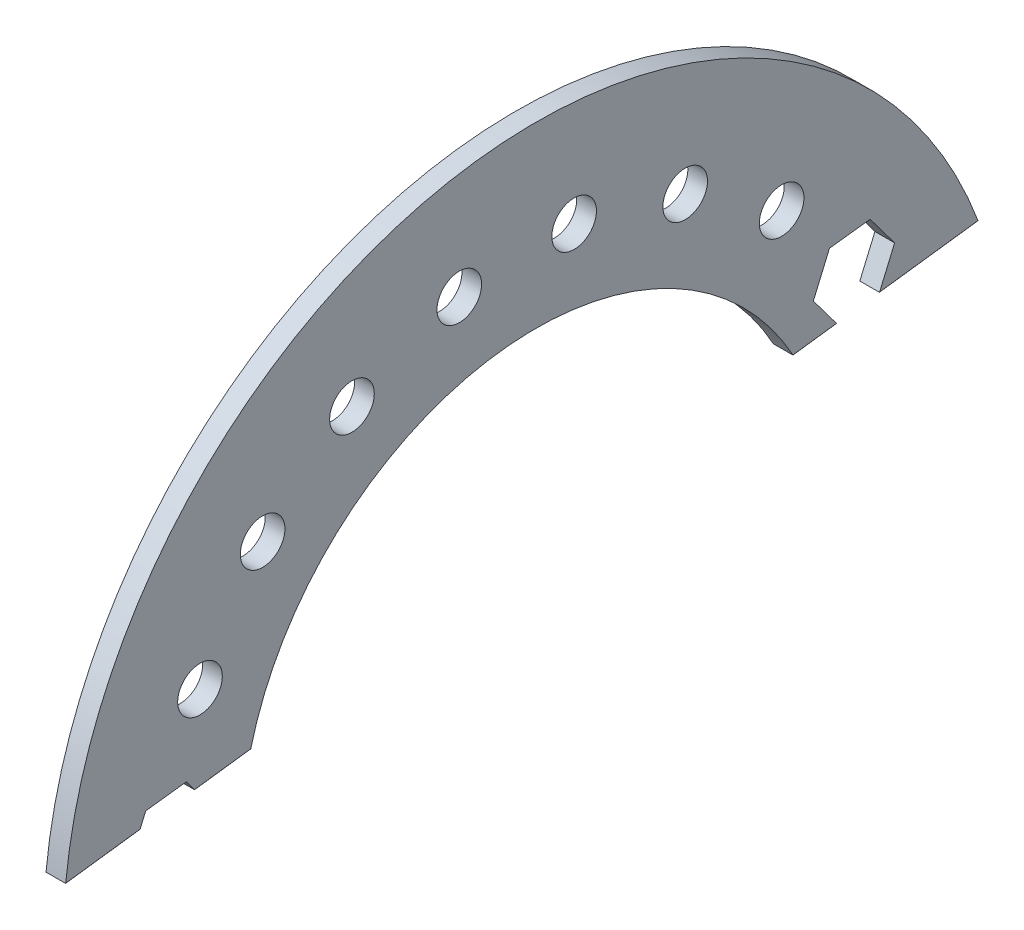
ISO-10303-21;
HEADER;
FILE_DESCRIPTION(('STEP AP214'),'2;1');
FILE_NAME('part.step','',(''),(''),'','','');
FILE_SCHEMA(('AUTOMOTIVE_DESIGN { 1 0 10303 214 1 1 1 1 }'));
ENDSEC;
DATA;
#1=APPLICATION_CONTEXT('core data for automotive mechanical design processes');
#2=APPLICATION_PROTOCOL_DEFINITION('international standard','automotive_design',2000,#1);
#3=PRODUCT_CONTEXT('',#1,'mechanical');
#4=PRODUCT('Part','Part','',(#3));
#5=PRODUCT_RELATED_PRODUCT_CATEGORY('part','',(#4));
#6=PRODUCT_DEFINITION_FORMATION('','',#4);
#7=PRODUCT_DEFINITION_CONTEXT('part definition',#1,'design');
#8=PRODUCT_DEFINITION('design','',#6,#7);
#9=PRODUCT_DEFINITION_SHAPE('','',#8);
#10=(LENGTH_UNIT() NAMED_UNIT(*) SI_UNIT(.MILLI.,.METRE.));
#11=(NAMED_UNIT(*) PLANE_ANGLE_UNIT() SI_UNIT($,.RADIAN.));
#12=(NAMED_UNIT(*) SI_UNIT($,.STERADIAN.) SOLID_ANGLE_UNIT());
#13=UNCERTAINTY_MEASURE_WITH_UNIT(LENGTH_MEASURE(1.E-05),#10,'distance_accuracy_value','');
#14=(GEOMETRIC_REPRESENTATION_CONTEXT(3) GLOBAL_UNCERTAINTY_ASSIGNED_CONTEXT((#13)) GLOBAL_UNIT_ASSIGNED_CONTEXT((#10,
#11,#12)) REPRESENTATION_CONTEXT('',''));
#15=CARTESIAN_POINT('',(0.,0.,0.));
#16=DIRECTION('',(0.,0.,1.));
#17=DIRECTION('',(1.,0.,0.));
#18=AXIS2_PLACEMENT_3D('',#15,#16,#17);
#19=CARTESIAN_POINT('',(4.,157.202027839605,-273.001781190754));
#20=DIRECTION('',(-1.,0.,0.));
#21=DIRECTION('',(0.,0.,1.));
#22=AXIS2_PLACEMENT_3D('',#19,#20,#21);
#23=CYLINDRICAL_SURFACE('',#22,4.24999999999995);
#24=CARTESIAN_POINT('',(0.,157.202027839605,-273.001781190754));
#25=DIRECTION('',(-1.,0.,0.));
#26=DIRECTION('',(0.,0.,1.));
#27=AXIS2_PLACEMENT_3D('',#24,#25,#26);
#28=CIRCLE('',#27,4.24999999999995);
#29=CARTESIAN_POINT('',(0.,157.202027839605,-268.751781190754));
#30=VERTEX_POINT('',#29);
#31=EDGE_CURVE('E301',#30,#30,#28,.T.);
#32=ORIENTED_EDGE('',*,*,#31,.T.);
#33=EDGE_LOOP('',(#32));
#34=FACE_BOUND('',#33,.T.);
#35=CARTESIAN_POINT('',(3.75,157.202027839605,-273.001781190754));
#36=DIRECTION('',(1.,0.,0.));
#37=DIRECTION('',(0.,0.,-1.));
#38=AXIS2_PLACEMENT_3D('',#35,#36,#37);
#39=CIRCLE('',#38,4.24999999999995);
#40=CARTESIAN_POINT('',(3.75,157.202027839605,-277.251781190754));
#41=VERTEX_POINT('',#40);
#42=EDGE_CURVE('E11',#41,#41,#39,.F.);
#43=ORIENTED_EDGE('',*,*,#42,.F.);
#44=EDGE_LOOP('',(#43));
#45=FACE_BOUND('',#44,.T.);
#46=ADVANCED_FACE('F35',(#34,#45),#23,.F.);
#47=CARTESIAN_POINT('',(4.,169.130072091169,-254.63420376094));
#48=DIRECTION('',(-1.,0.,0.));
#49=DIRECTION('',(0.,0.,1.));
#50=AXIS2_PLACEMENT_3D('',#47,#48,#49);
#51=CYLINDRICAL_SURFACE('',#50,4.24999999999995);
#52=CARTESIAN_POINT('',(0.,169.130072091169,-254.63420376094));
#53=DIRECTION('',(-1.,0.,0.));
#54=DIRECTION('',(0.,0.,1.));
#55=AXIS2_PLACEMENT_3D('',#52,#53,#54);
#56=CIRCLE('',#55,4.24999999999995);
#57=CARTESIAN_POINT('',(0.,169.130072091169,-250.38420376094));
#58=VERTEX_POINT('',#57);
#59=EDGE_CURVE('E304',#58,#58,#56,.T.);
#60=ORIENTED_EDGE('',*,*,#59,.T.);
#61=EDGE_LOOP('',(#60));
#62=FACE_BOUND('',#61,.T.);
#63=CARTESIAN_POINT('',(3.75,169.130072091169,-254.63420376094));
#64=DIRECTION('',(1.,0.,0.));
#65=DIRECTION('',(0.,0.,-1.));
#66=AXIS2_PLACEMENT_3D('',#63,#64,#65);
#67=CIRCLE('',#66,4.24999999999995);
#68=CARTESIAN_POINT('',(3.75,169.130072091169,-258.88420376094));
#69=VERTEX_POINT('',#68);
#70=EDGE_CURVE('E46',#69,#69,#67,.F.);
#71=ORIENTED_EDGE('',*,*,#70,.F.);
#72=EDGE_LOOP('',(#71));
#73=FACE_BOUND('',#72,.T.);
#74=ADVANCED_FACE('F423',(#62,#73),#51,.F.);
#75=CARTESIAN_POINT('',(4.,174.798422731966,-233.47963117437));
#76=DIRECTION('',(-1.,0.,0.));
#77=DIRECTION('',(0.,0.,1.));
#78=AXIS2_PLACEMENT_3D('',#75,#76,#77);
#79=CYLINDRICAL_SURFACE('',#78,4.25000000000001);
#80=CARTESIAN_POINT('',(0.,174.798422731966,-233.47963117437));
#81=DIRECTION('',(-1.,0.,0.));
#82=DIRECTION('',(0.,0.,1.));
#83=AXIS2_PLACEMENT_3D('',#80,#81,#82);
#84=CIRCLE('',#83,4.25000000000001);
#85=CARTESIAN_POINT('',(0.,174.798422731966,-229.22963117437));
#86=VERTEX_POINT('',#85);
#87=EDGE_CURVE('E307',#86,#86,#84,.T.);
#88=ORIENTED_EDGE('',*,*,#87,.T.);
#89=EDGE_LOOP('',(#88));
#90=FACE_BOUND('',#89,.T.);
#91=CARTESIAN_POINT('',(3.75,174.798422731966,-233.47963117437));
#92=DIRECTION('',(1.,0.,0.));
#93=DIRECTION('',(0.,0.,-1.));
#94=AXIS2_PLACEMENT_3D('',#91,#92,#93);
#95=CIRCLE('',#94,4.25000000000001);
#96=CARTESIAN_POINT('',(3.75,174.798422731966,-237.72963117437));
#97=VERTEX_POINT('',#96);
#98=EDGE_CURVE('E498',#97,#97,#95,.F.);
#99=ORIENTED_EDGE('',*,*,#98,.F.);
#100=EDGE_LOOP('',(#99));
#101=FACE_BOUND('',#100,.T.);
#102=ADVANCED_FACE('F429',(#90,#101),#79,.F.);
#103=CARTESIAN_POINT('',(4.,173.652222107554,-211.608820388391));
#104=DIRECTION('',(-1.,0.,0.));
#105=DIRECTION('',(0.,0.,1.));
#106=AXIS2_PLACEMENT_3D('',#103,#104,#105);
#107=CYLINDRICAL_SURFACE('',#106,4.25000000000001);
#108=CARTESIAN_POINT('',(0.,173.652222107554,-211.608820388391));
#109=DIRECTION('',(-1.,0.,0.));
#110=DIRECTION('',(0.,0.,1.));
#111=AXIS2_PLACEMENT_3D('',#108,#109,#110);
#112=CIRCLE('',#111,4.25000000000001);
#113=CARTESIAN_POINT('',(0.,173.652222107554,-207.358820388391));
#114=VERTEX_POINT('',#113);
#115=EDGE_CURVE('E310',#114,#114,#112,.T.);
#116=ORIENTED_EDGE('',*,*,#115,.T.);
#117=EDGE_LOOP('',(#116));
#118=FACE_BOUND('',#117,.T.);
#119=CARTESIAN_POINT('',(3.75,173.652222107554,-211.608820388391));
#120=DIRECTION('',(1.,0.,0.));
#121=DIRECTION('',(0.,0.,-1.));
#122=AXIS2_PLACEMENT_3D('',#119,#120,#121);
#123=CIRCLE('',#122,4.25000000000001);
#124=CARTESIAN_POINT('',(3.75,173.652222107554,-215.858820388391));
#125=VERTEX_POINT('',#124);
#126=EDGE_CURVE('E501',#125,#125,#123,.F.);
#127=ORIENTED_EDGE('',*,*,#126,.F.);
#128=EDGE_LOOP('',(#127));
#129=FACE_BOUND('',#128,.T.);
#130=ADVANCED_FACE('F437',(#118,#129),#107,.F.);
#131=CARTESIAN_POINT('',(4.,165.803668321098,-191.162638745634));
#132=DIRECTION('',(-1.,0.,0.));
#133=DIRECTION('',(0.,0.,1.));
#134=AXIS2_PLACEMENT_3D('',#131,#132,#133);
#135=CYLINDRICAL_SURFACE('',#134,4.25000000000001);
#136=CARTESIAN_POINT('',(0.,165.803668321098,-191.162638745634));
#137=DIRECTION('',(-1.,0.,0.));
#138=DIRECTION('',(0.,0.,1.));
#139=AXIS2_PLACEMENT_3D('',#136,#137,#138);
#140=CIRCLE('',#139,4.25000000000001);
#141=CARTESIAN_POINT('',(0.,165.803668321098,-186.912638745634));
#142=VERTEX_POINT('',#141);
#143=EDGE_CURVE('E313',#142,#142,#140,.T.);
#144=ORIENTED_EDGE('',*,*,#143,.T.);
#145=EDGE_LOOP('',(#144));
#146=FACE_BOUND('',#145,.T.);
#147=CARTESIAN_POINT('',(3.75,165.803668321098,-191.162638745634));
#148=DIRECTION('',(1.,0.,0.));
#149=DIRECTION('',(0.,0.,-1.));
#150=AXIS2_PLACEMENT_3D('',#147,#148,#149);
#151=CIRCLE('',#150,4.25000000000001);
#152=CARTESIAN_POINT('',(3.75,165.803668321098,-195.412638745634));
#153=VERTEX_POINT('',#152);
#154=EDGE_CURVE('E506',#153,#153,#151,.F.);
#155=ORIENTED_EDGE('',*,*,#154,.F.);
#156=EDGE_LOOP('',(#155));
#157=FACE_BOUND('',#156,.T.);
#158=ADVANCED_FACE('F441',(#146,#157),#135,.F.);
#159=CARTESIAN_POINT('',(4.,152.021032501307,-174.142500962217));
#160=DIRECTION('',(-1.,0.,0.));
#161=DIRECTION('',(0.,0.,1.));
#162=AXIS2_PLACEMENT_3D('',#159,#160,#161);
#163=CYLINDRICAL_SURFACE('',#162,4.25000000000001);
#164=CARTESIAN_POINT('',(0.,152.021032501307,-174.142500962217));
#165=DIRECTION('',(-1.,0.,0.));
#166=DIRECTION('',(0.,0.,1.));
#167=AXIS2_PLACEMENT_3D('',#164,#165,#166);
#168=CIRCLE('',#167,4.25000000000001);
#169=CARTESIAN_POINT('',(0.,152.021032501307,-169.892500962217));
#170=VERTEX_POINT('',#169);
#171=EDGE_CURVE('E316',#170,#170,#168,.T.);
#172=ORIENTED_EDGE('',*,*,#171,.T.);
#173=EDGE_LOOP('',(#172));
#174=FACE_BOUND('',#173,.T.);
#175=CARTESIAN_POINT('',(3.75,152.021032501307,-174.142500962217));
#176=DIRECTION('',(1.,0.,0.));
#177=DIRECTION('',(0.,0.,-1.));
#178=AXIS2_PLACEMENT_3D('',#175,#176,#177);
#179=CIRCLE('',#178,4.25000000000001);
#180=CARTESIAN_POINT('',(3.75,152.021032501307,-178.392500962217));
#181=VERTEX_POINT('',#180);
#182=EDGE_CURVE('E508',#181,#181,#179,.F.);
#183=ORIENTED_EDGE('',*,*,#182,.F.);
#184=EDGE_LOOP('',(#183));
#185=FACE_BOUND('',#184,.T.);
#186=ADVANCED_FACE('F445',(#174,#185),#163,.F.);
#187=CARTESIAN_POINT('',(4.,133.653455071493,-162.214456710652));
#188=DIRECTION('',(-1.,0.,0.));
#189=DIRECTION('',(0.,0.,1.));
#190=AXIS2_PLACEMENT_3D('',#187,#188,#189);
#191=CYLINDRICAL_SURFACE('',#190,4.25000000000001);
#192=CARTESIAN_POINT('',(0.,133.653455071493,-162.214456710652));
#193=DIRECTION('',(-1.,0.,0.));
#194=DIRECTION('',(0.,0.,1.));
#195=AXIS2_PLACEMENT_3D('',#192,#193,#194);
#196=CIRCLE('',#195,4.25000000000001);
#197=CARTESIAN_POINT('',(0.,133.653455071493,-157.964456710652));
#198=VERTEX_POINT('',#197);
#199=EDGE_CURVE('E319',#198,#198,#196,.T.);
#200=ORIENTED_EDGE('',*,*,#199,.T.);
#201=EDGE_LOOP('',(#200));
#202=FACE_BOUND('',#201,.T.);
#203=CARTESIAN_POINT('',(3.75,133.653455071493,-162.214456710652));
#204=DIRECTION('',(1.,0.,0.));
#205=DIRECTION('',(0.,0.,-1.));
#206=AXIS2_PLACEMENT_3D('',#203,#204,#205);
#207=CIRCLE('',#206,4.25000000000001);
#208=CARTESIAN_POINT('',(3.75,133.653455071493,-166.464456710652));
#209=VERTEX_POINT('',#208);
#210=EDGE_CURVE('E355',#209,#209,#207,.F.);
#211=ORIENTED_EDGE('',*,*,#210,.F.);
#212=EDGE_LOOP('',(#211));
#213=FACE_BOUND('',#212,.T.);
#214=ADVANCED_FACE('F449',(#202,#213),#191,.F.);
#215=CARTESIAN_POINT('',(145.321367132431,146.422235875612,-282.11450437174));
#216=DIRECTION('',(0.,0.992946793169425,0.118560811124734));
#217=DIRECTION('',(0.,-0.118560811124734,0.992946793169425));
#218=AXIS2_PLACEMENT_3D('',#215,#216,#217);
#219=PLANE('',#218);
#220=DIRECTION('',(0.,0.118560811124734,-0.992946793169425));
#221=VECTOR('',#220,1.);
#222=CARTESIAN_POINT('',(3.75,146.422235875612,-282.11450437174));
#223=LINE('',#222,#221);
#224=CARTESIAN_POINT('',(3.75,146.422235875612,-282.11450437174));
#225=VERTEX_POINT('',#224);
#226=CARTESIAN_POINT('',(3.75,147.346325944559,-289.853758699165));
#227=VERTEX_POINT('',#226);
#228=EDGE_CURVE('E369',#225,#227,#223,.T.);
#229=ORIENTED_EDGE('',*,*,#228,.F.);
#230=DIRECTION('',(-1.,0.,0.));
#231=VECTOR('',#230,1.);
#232=CARTESIAN_POINT('',(145.321367132431,146.422235875612,-282.11450437174));
#233=LINE('',#232,#231);
#234=CARTESIAN_POINT('',(0.,146.422235875612,-282.11450437174));
#235=VERTEX_POINT('',#234);
#236=EDGE_CURVE('E322',#225,#235,#233,.T.);
#237=ORIENTED_EDGE('',*,*,#236,.T.);
#238=DIRECTION('',(0.,0.118560811124734,-0.992946793169425));
#239=VECTOR('',#238,1.);
#240=CARTESIAN_POINT('',(0.,146.422235875612,-282.11450437174));
#241=LINE('',#240,#239);
#242=CARTESIAN_POINT('',(0.,147.346325944559,-289.853758699165));
#243=VERTEX_POINT('',#242);
#244=EDGE_CURVE('E334',#235,#243,#241,.T.);
#245=ORIENTED_EDGE('',*,*,#244,.T.);
#246=DIRECTION('',(-1.,0.,0.));
#247=VECTOR('',#246,1.);
#248=CARTESIAN_POINT('',(145.321367132431,147.346325944559,-289.853758699165));
#249=LINE('',#248,#247);
#250=EDGE_CURVE('E40',#227,#243,#249,.T.);
#251=ORIENTED_EDGE('',*,*,#250,.F.);
#252=EDGE_LOOP('',(#229,#237,#245,#251));
#253=FACE_BOUND('',#252,.T.);
#254=ADVANCED_FACE('F408',(#253),#219,.F.);
#255=CARTESIAN_POINT('',(145.321367132431,139.257799987241,-279.045162683121));
#256=DIRECTION('',(0.,0.393796722257408,0.919197553053381));
#257=DIRECTION('',(0.,-0.919197553053381,0.393796722257408));
#258=AXIS2_PLACEMENT_3D('',#255,#256,#257);
#259=PLANE('',#258);
#260=DIRECTION('',(0.,0.919197553053381,-0.393796722257408));
#261=VECTOR('',#260,1.);
#262=CARTESIAN_POINT('',(3.75,139.257799987241,-279.045162683121));
#263=LINE('',#262,#261);
#264=CARTESIAN_POINT('',(3.75,139.257799987241,-279.045162683121));
#265=VERTEX_POINT('',#264);
#266=EDGE_CURVE('E376',#265,#225,#263,.T.);
#267=ORIENTED_EDGE('',*,*,#266,.F.);
#268=DIRECTION('',(-1.,0.,0.));
#269=VECTOR('',#268,1.);
#270=CARTESIAN_POINT('',(145.321367132431,139.257799987241,-279.045162683121));
#271=LINE('',#270,#269);
#272=CARTESIAN_POINT('',(0.,139.257799987241,-279.045162683121));
#273=VERTEX_POINT('',#272);
#274=EDGE_CURVE('E331',#265,#273,#271,.T.);
#275=ORIENTED_EDGE('',*,*,#274,.T.);
#276=DIRECTION('',(0.,0.91919755305338,-0.393796722257408));
#277=VECTOR('',#276,1.);
#278=CARTESIAN_POINT('',(0.,139.257799987241,-279.045162683121));
#279=LINE('',#278,#277);
#280=EDGE_CURVE('E333',#273,#235,#279,.T.);
#281=ORIENTED_EDGE('',*,*,#280,.T.);
#282=ORIENTED_EDGE('',*,*,#236,.F.);
#283=EDGE_LOOP('',(#267,#275,#281,#282));
#284=FACE_BOUND('',#283,.T.);
#285=ADVANCED_FACE('F401',(#284),#259,.F.);
#286=CARTESIAN_POINT('',(145.321367132431,147.346325944559,-289.853758699165));
#287=DIRECTION('',(0.,0.59915007091202,-0.800636741928649));
#288=DIRECTION('',(0.,0.800636741928649,0.59915007091202));
#289=AXIS2_PLACEMENT_3D('',#286,#287,#288);
#290=PLANE('',#289);
#291=DIRECTION('',(0.,-0.800636741928649,-0.59915007091202));
#292=VECTOR('',#291,1.);
#293=CARTESIAN_POINT('',(3.75,147.346325944559,-289.853758699165));
#294=LINE('',#293,#292);
#295=CARTESIAN_POINT('',(3.75,141.105980125134,-294.523671337969));
#296=VERTEX_POINT('',#295);
#297=EDGE_CURVE('E367',#227,#296,#294,.T.);
#298=ORIENTED_EDGE('',*,*,#297,.F.);
#299=ORIENTED_EDGE('',*,*,#250,.T.);
#300=DIRECTION('',(0.,-0.800636741928649,-0.59915007091202));
#301=VECTOR('',#300,1.);
#302=CARTESIAN_POINT('',(0.,147.346325944559,-289.853758699165));
#303=LINE('',#302,#301);
#304=CARTESIAN_POINT('',(0.,141.105980125134,-294.523671337969));
#305=VERTEX_POINT('',#304);
#306=EDGE_CURVE('E192',#243,#305,#303,.T.);
#307=ORIENTED_EDGE('',*,*,#306,.T.);
#308=DIRECTION('',(-1.,0.,0.));
#309=VECTOR('',#308,1.);
#310=CARTESIAN_POINT('',(145.321367132431,141.105980125134,-294.523671337969));
#311=LINE('',#310,#309);
#312=EDGE_CURVE('E196',#296,#305,#311,.T.);
#313=ORIENTED_EDGE('',*,*,#312,.F.);
#314=EDGE_LOOP('',(#298,#299,#307,#313));
#315=FACE_BOUND('',#314,.T.);
#316=ADVANCED_FACE('F410',(#315),#290,.F.);
#317=CARTESIAN_POINT('',(145.321367132431,118.739228304347,-151.876193431051));
#318=DIRECTION('',(0.,0.992946793169425,0.118560811124735));
#319=DIRECTION('',(0.,-0.118560811124735,0.992946793169425));
#320=AXIS2_PLACEMENT_3D('',#317,#318,#319);
#321=PLANE('',#320);
#322=DIRECTION('',(0.,0.118560811124735,-0.992946793169425));
#323=VECTOR('',#322,1.);
#324=CARTESIAN_POINT('',(3.75,118.739228304347,-151.876193431051));
#325=LINE('',#324,#323);
#326=CARTESIAN_POINT('',(3.75,118.739228304347,-151.876193431051));
#327=VERTEX_POINT('',#326);
#328=CARTESIAN_POINT('',(3.75,119.663318373294,-159.615447758475));
#329=VERTEX_POINT('',#328);
#330=EDGE_CURVE('E365',#327,#329,#325,.T.);
#331=ORIENTED_EDGE('',*,*,#330,.F.);
#332=DIRECTION('',(-1.,0.,0.));
#333=VECTOR('',#332,1.);
#334=CARTESIAN_POINT('',(145.321367132431,118.739228304347,-151.876193431051));
#335=LINE('',#334,#333);
#336=CARTESIAN_POINT('',(0.,118.739228304347,-151.876193431051));
#337=VERTEX_POINT('',#336);
#338=EDGE_CURVE('E197',#327,#337,#335,.T.);
#339=ORIENTED_EDGE('',*,*,#338,.T.);
#340=DIRECTION('',(0.,0.118560811124735,-0.992946793169425));
#341=VECTOR('',#340,1.);
#342=CARTESIAN_POINT('',(0.,118.739228304347,-151.876193431051));
#343=LINE('',#342,#341);
#344=CARTESIAN_POINT('',(0.,119.663318373294,-159.615447758475));
#345=VERTEX_POINT('',#344);
#346=EDGE_CURVE('E199',#337,#345,#343,.T.);
#347=ORIENTED_EDGE('',*,*,#346,.T.);
#348=DIRECTION('',(-1.,0.,0.));
#349=VECTOR('',#348,1.);
#350=CARTESIAN_POINT('',(145.321367132431,119.663318373294,-159.615447758475));
#351=LINE('',#350,#349);
#352=EDGE_CURVE('E188',#329,#345,#351,.T.);
#353=ORIENTED_EDGE('',*,*,#352,.F.);
#354=EDGE_LOOP('',(#331,#339,#347,#353));
#355=FACE_BOUND('',#354,.T.);
#356=ADVANCED_FACE('F412',(#355),#321,.F.);
#357=CARTESIAN_POINT('',(145.321367132431,133.017454167817,-283.715075321925));
#358=DIRECTION('',(0.,-0.59915007091202,0.800636741928649));
#359=DIRECTION('',(0.,-0.800636741928649,-0.59915007091202));
#360=AXIS2_PLACEMENT_3D('',#357,#358,#359);
#361=PLANE('',#360);
#362=DIRECTION('',(0.,0.800636741928649,0.59915007091202));
#363=VECTOR('',#362,1.);
#364=CARTESIAN_POINT('',(3.75,133.017454167817,-283.715075321925));
#365=LINE('',#364,#363);
#366=CARTESIAN_POINT('',(3.75000000000009,133.36816133066,-283.452626435329));
#367=VERTEX_POINT('',#366);
#368=EDGE_CURVE('E378',#367,#265,#365,.T.);
#369=ORIENTED_EDGE('',*,*,#368,.F.);
#370=CARTESIAN_POINT('',(34.,119.075359540964,-294.148529779959));
#371=DIRECTION('',(0.,-0.59915007091202,0.800636741928649));
#372=DIRECTION('',(0.,-0.800636741928649,-0.59915007091202));
#373=AXIS2_PLACEMENT_3D('',#370,#371,#372);
#374=ELLIPSE('',#373,39.0592773065958,34.01);
#375=CARTESIAN_POINT('',(3.72740348103585,133.327653987745,-283.482939779833));
#376=VERTEX_POINT('',#375);
#377=EDGE_CURVE('E203',#367,#376,#374,.T.);
#378=ORIENTED_EDGE('',*,*,#377,.T.);
#379=DIRECTION('',(-1.,0.,0.));
#380=VECTOR('',#379,1.);
#381=CARTESIAN_POINT('',(4.,133.327653987745,-283.482939779833));
#382=LINE('',#381,#380);
#383=CARTESIAN_POINT('',(0.,133.327653987745,-283.482939779833));
#384=VERTEX_POINT('',#383);
#385=EDGE_CURVE('E323',#376,#384,#382,.T.);
#386=ORIENTED_EDGE('',*,*,#385,.T.);
#387=DIRECTION('',(0.,0.800636741928649,0.59915007091202));
#388=VECTOR('',#387,1.);
#389=CARTESIAN_POINT('',(0.,133.017454167817,-283.715075321925));
#390=LINE('',#389,#388);
#391=EDGE_CURVE('E325',#384,#273,#390,.T.);
#392=ORIENTED_EDGE('',*,*,#391,.T.);
#393=ORIENTED_EDGE('',*,*,#274,.F.);
#394=EDGE_LOOP('',(#369,#378,#386,#392,#393));
#395=FACE_BOUND('',#394,.T.);
#396=ADVANCED_FACE('F217',(#395),#361,.F.);
#397=CARTESIAN_POINT('',(4.,105.17999306,-226.16160191));
#398=DIRECTION('',(-1.,0.,0.));
#399=DIRECTION('',(0.,0.,1.));
#400=AXIS2_PLACEMENT_3D('',#397,#398,#399);
#401=CYLINDRICAL_SURFACE('',#400,56.);
#402=CARTESIAN_POINT('',(4.00000000000001,132.746599509374,-274.906675598172));
#403=CARTESIAN_POINT('',(3.95386687206442,132.665424116054,-274.952584346681));
#404=CARTESIAN_POINT('',(3.90808393151628,132.583985857674,-274.998371198792));
#405=CARTESIAN_POINT('',(3.81721842519489,132.420583610791,-275.089701110215));
#406=CARTESIAN_POINT('',(3.77213585942165,132.338619622289,-275.135244169527));
#407=CARTESIAN_POINT('',(3.72740348103585,132.256392768726,-275.180665332441));
#408=B_SPLINE_CURVE_WITH_KNOTS('',3,(#402,#403,#404,#405,#406,#407),.UNSPECIFIED.,.F.,.F.,(4,2,
4),(0.,0.312125504556778,0.624251009113571),.UNSPECIFIED.);
#409=CARTESIAN_POINT('',(3.7500000000001,132.297853529683,-275.157740977755));
#410=VERTEX_POINT('',#409);
#411=CARTESIAN_POINT('',(3.72740348103632,132.256392768727,-275.180665332441));
#412=VERTEX_POINT('',#411);
#413=EDGE_CURVE('E204',#410,#412,#408,.T.);
#414=ORIENTED_EDGE('',*,*,#413,.F.);
#415=CARTESIAN_POINT('',(3.75,105.17999306,-226.16160191));
#416=DIRECTION('',(1.,0.,0.));
#417=DIRECTION('',(0.,0.,-1.));
#418=AXIS2_PLACEMENT_3D('',#415,#416,#417);
#419=CIRCLE('',#418,56.);
#420=CARTESIAN_POINT('',(3.75,118.972557701809,-171.88669831173));
#421=VERTEX_POINT('',#420);
#422=EDGE_CURVE('E97',#410,#421,#419,.T.);
#423=ORIENTED_EDGE('',*,*,#422,.T.);
#424=CARTESIAN_POINT('',(3.72740348103586,118.926635839919,-171.875049134186));
#425=CARTESIAN_POINT('',(3.77213585942164,119.01769912039,-171.898110279805));
#426=CARTESIAN_POINT('',(3.81721842519488,119.108539087477,-171.921356054525));
#427=CARTESIAN_POINT('',(3.90808393151628,119.289772394884,-171.968216862169));
#428=CARTESIAN_POINT('',(3.95386687206444,119.380165735204,-171.991831895092));
#429=CARTESIAN_POINT('',(4.00000000000006,119.470335762141,-172.015631557116));
#430=B_SPLINE_CURVE_WITH_KNOTS('',3,(#424,#425,#426,#427,#428,#429),.UNSPECIFIED.,.F.,.F.,(4,2,
4),(0.,0.31212550455675,0.624251009113524),.UNSPECIFIED.);
#431=CARTESIAN_POINT('',(3.72740348103604,118.92663583992,-171.875049134186));
#432=VERTEX_POINT('',#431);
#433=EDGE_CURVE('E181',#432,#421,#430,.T.);
#434=ORIENTED_EDGE('',*,*,#433,.F.);
#435=DIRECTION('',(-1.,0.,0.));
#436=VECTOR('',#435,1.);
#437=CARTESIAN_POINT('',(4.,118.926635839919,-171.875049134186));
#438=LINE('',#437,#436);
#439=CARTESIAN_POINT('',(0.,118.926635839919,-171.875049134186));
#440=VERTEX_POINT('',#439);
#441=EDGE_CURVE('E180',#432,#440,#438,.T.);
#442=ORIENTED_EDGE('',*,*,#441,.T.);
#443=CARTESIAN_POINT('',(0.,105.17999306,-226.16160191));
#444=DIRECTION('',(1.,0.,0.));
#445=DIRECTION('',(0.,0.,-1.));
#446=AXIS2_PLACEMENT_3D('',#443,#444,#445);
#447=CIRCLE('',#446,56.);
#448=CARTESIAN_POINT('',(0.,132.256392768726,-275.180665332441));
#449=VERTEX_POINT('',#448);
#450=EDGE_CURVE('E292',#449,#440,#447,.T.);
#451=ORIENTED_EDGE('',*,*,#450,.F.);
#452=DIRECTION('',(-1.,0.,0.));
#453=VECTOR('',#452,1.);
#454=CARTESIAN_POINT('',(4.,132.256392768726,-275.180665332441));
#455=LINE('',#454,#453);
#456=EDGE_CURVE('E287',#412,#449,#455,.T.);
#457=ORIENTED_EDGE('',*,*,#456,.F.);
#458=EDGE_LOOP('',(#414,#423,#434,#442,#451,#457));
#459=FACE_BOUND('',#458,.T.);
#460=ADVANCED_FACE('F212',(#459),#401,.F.);
#461=CARTESIAN_POINT('',(145.321367132431,119.663318373294,-159.615447758475));
#462=DIRECTION('',(0.,0.59915007091202,-0.800636741928648));
#463=DIRECTION('',(0.,0.800636741928648,0.59915007091202));
#464=AXIS2_PLACEMENT_3D('',#461,#462,#463);
#465=PLANE('',#464);
#466=DIRECTION('',(0.,-0.800636741928648,-0.59915007091202));
#467=VECTOR('',#466,1.);
#468=CARTESIAN_POINT('',(3.75,119.663318373294,-159.615447758475));
#469=LINE('',#468,#467);
#470=CARTESIAN_POINT('',(3.75000000000007,117.589426097071,-161.167428375015));
#471=VERTEX_POINT('',#470);
#472=EDGE_CURVE('E371',#329,#471,#469,.T.);
#473=ORIENTED_EDGE('',*,*,#472,.F.);
#474=ORIENTED_EDGE('',*,*,#352,.T.);
#475=DIRECTION('',(0.,-0.800636741928648,-0.59915007091202));
#476=VECTOR('',#475,1.);
#477=CARTESIAN_POINT('',(0.,119.663318373294,-159.615447758475));
#478=LINE('',#477,#476);
#479=CARTESIAN_POINT('',(0.,117.548918754156,-161.197741719518));
#480=VERTEX_POINT('',#479);
#481=EDGE_CURVE('E186',#345,#480,#478,.T.);
#482=ORIENTED_EDGE('',*,*,#481,.T.);
#483=DIRECTION('',(1.,0.,0.));
#484=VECTOR('',#483,1.);
#485=CARTESIAN_POINT('',(4.,117.548918754156,-161.197741719518));
#486=LINE('',#485,#484);
#487=CARTESIAN_POINT('',(3.72740348103586,117.548918754156,-161.197741719518));
#488=VERTEX_POINT('',#487);
#489=EDGE_CURVE('E172',#480,#488,#486,.T.);
#490=ORIENTED_EDGE('',*,*,#489,.T.);
#491=CARTESIAN_POINT('',(34.,103.296624307375,-171.863331719645));
#492=DIRECTION('',(0.,0.59915007091202,-0.800636741928648));
#493=DIRECTION('',(0.,-0.800636741928648,-0.59915007091202));
#494=AXIS2_PLACEMENT_3D('',#491,#492,#493);
#495=ELLIPSE('',#494,39.0592773065958,34.01);
#496=EDGE_CURVE('E162',#488,#471,#495,.T.);
#497=ORIENTED_EDGE('',*,*,#496,.T.);
#498=EDGE_LOOP('',(#473,#474,#482,#490,#497));
#499=FACE_BOUND('',#498,.T.);
#500=ADVANCED_FACE('F184',(#499),#465,.F.);
#501=CARTESIAN_POINT('',(145.321367132431,111.574792415976,-148.806851742431));
#502=DIRECTION('',(0.,0.393796722257402,0.919197553053383));
#503=DIRECTION('',(0.,-0.919197553053383,0.393796722257402));
#504=AXIS2_PLACEMENT_3D('',#501,#502,#503);
#505=PLANE('',#504);
#506=DIRECTION('',(0.,0.919197553053383,-0.393796722257402));
#507=VECTOR('',#506,1.);
#508=CARTESIAN_POINT('',(3.75,111.574792415976,-148.806851742431));
#509=LINE('',#508,#507);
#510=CARTESIAN_POINT('',(3.75,116.253127474915,-150.811114053305));
#511=VERTEX_POINT('',#510);
#512=EDGE_CURVE('E362',#511,#327,#509,.T.);
#513=ORIENTED_EDGE('',*,*,#512,.F.);
#514=CARTESIAN_POINT('',(34.,99.6631276595423,-143.703732698945));
#515=DIRECTION('',(0.,0.393796722257402,0.919197553053383));
#516=DIRECTION('',(0.,0.919197553053383,-0.393796722257402));
#517=AXIS2_PLACEMENT_3D('',#514,#515,#516);
#518=ELLIPSE('',#517,39.4893395644892,34.01);
#519=CARTESIAN_POINT('',(3.72740348103584,116.206109624855,-150.790970967436));
#520=VERTEX_POINT('',#519);
#521=EDGE_CURVE('E171',#511,#520,#518,.T.);
#522=ORIENTED_EDGE('',*,*,#521,.T.);
#523=DIRECTION('',(-1.,0.,0.));
#524=VECTOR('',#523,1.);
#525=CARTESIAN_POINT('',(4.,116.206109624855,-150.790970967436));
#526=LINE('',#525,#524);
#527=CARTESIAN_POINT('',(0.,116.206109624855,-150.790970967436));
#528=VERTEX_POINT('',#527);
#529=EDGE_CURVE('E194',#520,#528,#526,.T.);
#530=ORIENTED_EDGE('',*,*,#529,.T.);
#531=DIRECTION('',(0.,-0.919197553053383,0.393796722257402));
#532=VECTOR('',#531,1.);
#533=CARTESIAN_POINT('',(0.,134.172311184822,-158.487935849717));
#534=LINE('',#533,#532);
#535=EDGE_CURVE('E272',#337,#528,#534,.T.);
#536=ORIENTED_EDGE('',*,*,#535,.F.);
#537=ORIENTED_EDGE('',*,*,#338,.F.);
#538=EDGE_LOOP('',(#513,#522,#530,#536,#537));
#539=FACE_BOUND('',#538,.T.);
#540=ADVANCED_FACE('F270',(#539),#505,.F.);
#541=CARTESIAN_POINT('',(145.321367132431,141.105980125134,-294.523671337969));
#542=DIRECTION('',(0.,-0.393796722257408,-0.919197553053381));
#543=DIRECTION('',(0.,0.919197553053381,-0.393796722257408));
#544=AXIS2_PLACEMENT_3D('',#541,#542,#543);
#545=PLANE('',#544);
#546=DIRECTION('',(0.,-0.919197553053381,0.393796722257408));
#547=VECTOR('',#546,1.);
#548=CARTESIAN_POINT('',(3.75,141.105980125134,-294.523671337969));
#549=LINE('',#548,#547);
#550=CARTESIAN_POINT('',(3.75,134.427502537568,-291.662520788866));
#551=VERTEX_POINT('',#550);
#552=EDGE_CURVE('E356',#296,#551,#549,.T.);
#553=ORIENTED_EDGE('',*,*,#552,.F.);
#554=ORIENTED_EDGE('',*,*,#312,.T.);
#555=DIRECTION('',(0.,-0.91919755305338,0.393796722257408));
#556=VECTOR('',#555,1.);
#557=CARTESIAN_POINT('',(0.,141.105980125134,-294.523671337969));
#558=LINE('',#557,#556);
#559=CARTESIAN_POINT('',(0.,134.380484687508,-291.642377702997));
#560=VERTEX_POINT('',#559);
#561=EDGE_CURVE('E329',#305,#560,#558,.T.);
#562=ORIENTED_EDGE('',*,*,#561,.T.);
#563=DIRECTION('',(1.,0.,0.));
#564=VECTOR('',#563,1.);
#565=CARTESIAN_POINT('',(4.,134.380484687508,-291.642377702997));
#566=LINE('',#565,#564);
#567=CARTESIAN_POINT('',(3.72740348103588,134.380484687508,-291.642377702997));
#568=VERTEX_POINT('',#567);
#569=EDGE_CURVE('E326',#560,#568,#566,.T.);
#570=ORIENTED_EDGE('',*,*,#569,.T.);
#571=CARTESIAN_POINT('',(34.,117.837502722195,-284.555139434506));
#572=DIRECTION('',(0.,-0.393796722257408,-0.919197553053381));
#573=DIRECTION('',(0.,0.919197553053381,-0.393796722257408));
#574=AXIS2_PLACEMENT_3D('',#571,#572,#573);
#575=ELLIPSE('',#574,39.4893395644894,34.01);
#576=EDGE_CURVE('E228',#568,#551,#575,.T.);
#577=ORIENTED_EDGE('',*,*,#576,.T.);
#578=EDGE_LOOP('',(#553,#554,#562,#570,#577));
#579=FACE_BOUND('',#578,.T.);
#580=ADVANCED_FACE('F242',(#579),#545,.F.);
#581=CARTESIAN_POINT('',(4.,105.17999306,-226.16160191));
#582=DIRECTION('',(-1.,0.,0.));
#583=DIRECTION('',(0.,0.,1.));
#584=AXIS2_PLACEMENT_3D('',#581,#582,#583);
#585=CYLINDRICAL_SURFACE('',#584,90.);
#586=CARTESIAN_POINT('',(3.99999999999999,114.912104334727,-136.68933799466));
#587=CARTESIAN_POINT('',(3.95383279947593,114.823698609816,-136.67972077631));
#588=CARTESIAN_POINT('',(3.90803282263356,114.735093112811,-136.670216080562));
#589=CARTESIAN_POINT('',(3.81716731631218,114.557482574611,-136.65143173427));
#590=CARTESIAN_POINT('',(3.77210178683317,114.468477533415,-136.642152083726));
#591=CARTESIAN_POINT('',(3.72740348103585,114.379272720125,-136.632984955784));
#592=B_SPLINE_CURVE_WITH_KNOTS('',3,(#586,#587,#588,#589,#590,#591),.UNSPECIFIED.,.F.,.F.,(4,2,
4),(0.,0.300583101614709,0.601166203229386),.UNSPECIFIED.);
#593=CARTESIAN_POINT('',(3.75000000000006,114.424289791326,-136.637622005489));
#594=VERTEX_POINT('',#593);
#595=CARTESIAN_POINT('',(3.72740348103596,114.379272720126,-136.632984955784));
#596=VERTEX_POINT('',#595);
#597=EDGE_CURVE('E231',#594,#596,#592,.T.);
#598=ORIENTED_EDGE('',*,*,#597,.F.);
#599=CARTESIAN_POINT('',(3.75,105.17999306,-226.16160191));
#600=DIRECTION('',(1.,0.,0.));
#601=DIRECTION('',(0.,0.,-1.));
#602=AXIS2_PLACEMENT_3D('',#599,#600,#601);
#603=CIRCLE('',#602,90.);
#604=CARTESIAN_POINT('',(3.75000000000009,136.846121440166,-310.406817283995));
#605=VERTEX_POINT('',#604);
#606=EDGE_CURVE('E55',#594,#605,#603,.F.);
#607=ORIENTED_EDGE('',*,*,#606,.T.);
#608=CARTESIAN_POINT('',(3.72740348103584,136.80375588852,-310.422729510843));
#609=CARTESIAN_POINT('',(3.77210178683316,136.887711979441,-310.391219040422));
#610=CARTESIAN_POINT('',(3.81716731631216,136.971446278923,-310.359650442694));
#611=CARTESIAN_POINT('',(3.90803282263357,137.138471295012,-310.296396992623));
#612=CARTESIAN_POINT('',(3.95383279947598,137.221762011619,-310.264712140279));
#613=CARTESIAN_POINT('',(4.00000000000007,137.304830936787,-310.232969160629));
#614=B_SPLINE_CURVE_WITH_KNOTS('',3,(#608,#609,#610,#611,#612,#613),.UNSPECIFIED.,.F.,.F.,(4,2,
4),(0.,0.300583101614702,0.601166203229434),.UNSPECIFIED.);
#615=CARTESIAN_POINT('',(3.72740348103632,136.803755888521,-310.422729510843));
#616=VERTEX_POINT('',#615);
#617=EDGE_CURVE('E182',#616,#605,#614,.T.);
#618=ORIENTED_EDGE('',*,*,#617,.F.);
#619=DIRECTION('',(-1.,0.,0.));
#620=VECTOR('',#619,1.);
#621=CARTESIAN_POINT('',(4.,136.80375588852,-310.422729510843));
#622=LINE('',#621,#620);
#623=CARTESIAN_POINT('',(0.,136.80375588852,-310.422729510843));
#624=VERTEX_POINT('',#623);
#625=EDGE_CURVE('E238',#616,#624,#622,.T.);
#626=ORIENTED_EDGE('',*,*,#625,.T.);
#627=CARTESIAN_POINT('',(0.,105.17999306,-226.16160191));
#628=DIRECTION('',(-1.,0.,0.));
#629=DIRECTION('',(0.,0.,-1.));
#630=AXIS2_PLACEMENT_3D('',#627,#628,#629);
#631=CIRCLE('',#630,90.);
#632=CARTESIAN_POINT('',(0.,114.379272720125,-136.632984955784));
#633=VERTEX_POINT('',#632);
#634=EDGE_CURVE('E280',#633,#624,#631,.T.);
#635=ORIENTED_EDGE('',*,*,#634,.F.);
#636=DIRECTION('',(-1.,0.,0.));
#637=VECTOR('',#636,1.);
#638=CARTESIAN_POINT('',(4.,114.379272720125,-136.632984955784));
#639=LINE('',#638,#637);
#640=EDGE_CURVE('E290',#596,#633,#639,.T.);
#641=ORIENTED_EDGE('',*,*,#640,.F.);
#642=EDGE_LOOP('',(#598,#607,#618,#626,#635,#641));
#643=FACE_BOUND('',#642,.T.);
#644=ADVANCED_FACE('F239',(#643),#585,.T.);
#645=CARTESIAN_POINT('',(33.9999999999999,44.9392048245119,280.406669272539));
#646=DIRECTION('',(0.,0.127971337630197,-0.991777866634025));
#647=DIRECTION('',(0.,0.991777866634025,0.127971337630197));
#648=AXIS2_PLACEMENT_3D('',#645,#646,#647);
#649=CYLINDRICAL_SURFACE('',#648,34.01);
#650=DIRECTION('',(0.,0.127971337630197,-0.991777866634025));
#651=VECTOR('',#650,1.);
#652=CARTESIAN_POINT('',(3.75,60.3554530687624,282.395862594378));
#653=LINE('',#652,#651);
#654=EDGE_CURVE('E289',#594,#511,#653,.T.);
#655=ORIENTED_EDGE('',*,*,#654,.F.);
#656=ORIENTED_EDGE('',*,*,#597,.T.);
#657=DIRECTION('',(0.,0.127971337630197,-0.991777866634025));
#658=VECTOR('',#657,1.);
#659=CARTESIAN_POINT('',(3.7274034810359,60.3117617573395,282.390225005807));
#660=LINE('',#659,#658);
#661=EDGE_CURVE('E237',#596,#520,#660,.T.);
#662=ORIENTED_EDGE('',*,*,#661,.T.);
#663=ORIENTED_EDGE('',*,*,#521,.F.);
#664=EDGE_LOOP('',(#655,#656,#662,#663));
#665=FACE_BOUND('',#664,.T.);
#666=ADVANCED_FACE('F37',(#665),#649,.F.);
#667=DIRECTION('',(0.,0.127971337630197,-0.991777866634025));
#668=VECTOR('',#667,1.);
#669=CARTESIAN_POINT('',(3.75,60.3554530687624,282.395862594378));
#670=LINE('',#669,#668);
#671=EDGE_CURVE('E354',#551,#605,#670,.T.);
#672=ORIENTED_EDGE('',*,*,#671,.F.);
#673=ORIENTED_EDGE('',*,*,#576,.F.);
#674=DIRECTION('',(0.,0.127971337630197,-0.991777866634025));
#675=VECTOR('',#674,1.);
#676=CARTESIAN_POINT('',(3.72740348103623,60.3117617573402,282.390225005807));
#677=LINE('',#676,#675);
#678=EDGE_CURVE('E250',#568,#616,#677,.T.);
#679=ORIENTED_EDGE('',*,*,#678,.T.);
#680=ORIENTED_EDGE('',*,*,#617,.T.);
#681=EDGE_LOOP('',(#672,#673,#679,#680));
#682=FACE_BOUND('',#681,.T.);
#683=ADVANCED_FACE('F353',(#682),#649,.F.);
#684=DIRECTION('',(0.,0.127971337630197,-0.991777866634025));
#685=VECTOR('',#684,1.);
#686=CARTESIAN_POINT('',(3.75,60.3554530687624,282.395862594378));
#687=LINE('',#686,#685);
#688=EDGE_CURVE('E93',#471,#421,#687,.T.);
#689=ORIENTED_EDGE('',*,*,#688,.F.);
#690=ORIENTED_EDGE('',*,*,#496,.F.);
#691=DIRECTION('',(0.,0.127971337630197,-0.991777866634025));
#692=VECTOR('',#691,1.);
#693=CARTESIAN_POINT('',(3.72740348103597,60.3117617573396,282.390225005807));
#694=LINE('',#693,#692);
#695=EDGE_CURVE('E166',#488,#432,#694,.T.);
#696=ORIENTED_EDGE('',*,*,#695,.T.);
#697=ORIENTED_EDGE('',*,*,#433,.T.);
#698=EDGE_LOOP('',(#689,#690,#696,#697));
#699=FACE_BOUND('',#698,.T.);
#700=ADVANCED_FACE('F164',(#699),#649,.F.);
#701=DIRECTION('',(0.,0.127971337630197,-0.991777866634025));
#702=VECTOR('',#701,1.);
#703=CARTESIAN_POINT('',(3.75,60.3554530687624,282.395862594378));
#704=LINE('',#703,#702);
#705=EDGE_CURVE('E374',#410,#367,#704,.T.);
#706=ORIENTED_EDGE('',*,*,#705,.F.);
#707=ORIENTED_EDGE('',*,*,#413,.T.);
#708=DIRECTION('',(0.,0.127971337630197,-0.991777866634025));
#709=VECTOR('',#708,1.);
#710=CARTESIAN_POINT('',(3.72740348103623,60.3117617573402,282.390225005807));
#711=LINE('',#710,#709);
#712=EDGE_CURVE('E210',#412,#376,#711,.T.);
#713=ORIENTED_EDGE('',*,*,#712,.T.);
#714=ORIENTED_EDGE('',*,*,#377,.F.);
#715=EDGE_LOOP('',(#706,#707,#713,#714));
#716=FACE_BOUND('',#715,.T.);
#717=ADVANCED_FACE('F385',(#716),#649,.F.);
#718=CARTESIAN_POINT('',(0.,105.17999306,-226.16160191));
#719=DIRECTION('',(1.,0.,0.));
#720=DIRECTION('',(0.,0.,-1.));
#721=AXIS2_PLACEMENT_3D('',#718,#719,#720);
#722=PLANE('',#721);
#723=ORIENTED_EDGE('',*,*,#199,.F.);
#724=EDGE_LOOP('',(#723));
#725=FACE_BOUND('',#724,.T.);
#726=ORIENTED_EDGE('',*,*,#171,.F.);
#727=EDGE_LOOP('',(#726));
#728=FACE_BOUND('',#727,.T.);
#729=ORIENTED_EDGE('',*,*,#143,.F.);
#730=EDGE_LOOP('',(#729));
#731=FACE_BOUND('',#730,.T.);
#732=ORIENTED_EDGE('',*,*,#115,.F.);
#733=EDGE_LOOP('',(#732));
#734=FACE_BOUND('',#733,.T.);
#735=ORIENTED_EDGE('',*,*,#87,.F.);
#736=EDGE_LOOP('',(#735));
#737=FACE_BOUND('',#736,.T.);
#738=ORIENTED_EDGE('',*,*,#59,.F.);
#739=EDGE_LOOP('',(#738));
#740=FACE_BOUND('',#739,.T.);
#741=ORIENTED_EDGE('',*,*,#31,.F.);
#742=EDGE_LOOP('',(#741));
#743=FACE_BOUND('',#742,.T.);
#744=DIRECTION('',(0.,-0.127971337630196,0.991777866634025));
#745=VECTOR('',#744,1.);
#746=CARTESIAN_POINT('',(0.,118.926635839919,-171.875049134186));
#747=LINE('',#746,#745);
#748=EDGE_CURVE('E278',#440,#480,#747,.T.);
#749=ORIENTED_EDGE('',*,*,#748,.T.);
#750=ORIENTED_EDGE('',*,*,#481,.F.);
#751=ORIENTED_EDGE('',*,*,#346,.F.);
#752=ORIENTED_EDGE('',*,*,#535,.T.);
#753=DIRECTION('',(0.,-0.127971337630197,0.991777866634025));
#754=VECTOR('',#753,1.);
#755=CARTESIAN_POINT('',(0.,116.243256813962,-151.07886168302));
#756=LINE('',#755,#754);
#757=EDGE_CURVE('E265',#528,#633,#756,.T.);
#758=ORIENTED_EDGE('',*,*,#757,.T.);
#759=ORIENTED_EDGE('',*,*,#634,.T.);
#760=DIRECTION('',(0.,-0.127971337630196,0.991777866634025));
#761=VECTOR('',#760,1.);
#762=CARTESIAN_POINT('',(0.,136.80375588852,-310.422729510843));
#763=LINE('',#762,#761);
#764=EDGE_CURVE('E297',#624,#560,#763,.T.);
#765=ORIENTED_EDGE('',*,*,#764,.T.);
#766=ORIENTED_EDGE('',*,*,#561,.F.);
#767=ORIENTED_EDGE('',*,*,#306,.F.);
#768=ORIENTED_EDGE('',*,*,#244,.F.);
#769=ORIENTED_EDGE('',*,*,#280,.F.);
#770=ORIENTED_EDGE('',*,*,#391,.F.);
#771=EDGE_CURVE('E296',#384,#449,#763,.T.);
#772=ORIENTED_EDGE('',*,*,#771,.T.);
#773=ORIENTED_EDGE('',*,*,#450,.T.);
#774=EDGE_LOOP('',(#749,#750,#751,#752,#758,#759,#765,#766,#767,#768,#769,#770,#772,#773));
#775=FACE_BOUND('',#774,.T.);
#776=ADVANCED_FACE('F275',(#725,#728,#731,#734,#737,#740,#743,#775),#722,.F.);
#777=CARTESIAN_POINT('',(4.,118.926635839919,-171.875049134186));
#778=DIRECTION('',(0.,-0.991777866634025,-0.127971337630196));
#779=DIRECTION('',(0.,0.127971337630196,-0.991777866634025));
#780=AXIS2_PLACEMENT_3D('',#777,#778,#779);
#781=PLANE('',#780);
#782=ORIENTED_EDGE('',*,*,#695,.F.);
#783=ORIENTED_EDGE('',*,*,#489,.F.);
#784=ORIENTED_EDGE('',*,*,#748,.F.);
#785=ORIENTED_EDGE('',*,*,#441,.F.);
#786=EDGE_LOOP('',(#782,#783,#784,#785));
#787=FACE_BOUND('',#786,.T.);
#788=ADVANCED_FACE('F177',(#787),#781,.T.);
#789=CARTESIAN_POINT('',(4.,116.243256813962,-151.07886168302));
#790=DIRECTION('',(0.,-0.991777866634025,-0.127971337630197));
#791=DIRECTION('',(0.,0.127971337630197,-0.991777866634025));
#792=AXIS2_PLACEMENT_3D('',#789,#790,#791);
#793=PLANE('',#792);
#794=ORIENTED_EDGE('',*,*,#661,.F.);
#795=ORIENTED_EDGE('',*,*,#640,.T.);
#796=ORIENTED_EDGE('',*,*,#757,.F.);
#797=ORIENTED_EDGE('',*,*,#529,.F.);
#798=EDGE_LOOP('',(#794,#795,#796,#797));
#799=FACE_BOUND('',#798,.T.);
#800=ADVANCED_FACE('F263',(#799),#793,.T.);
#801=CARTESIAN_POINT('',(4.,136.80375588852,-310.422729510843));
#802=DIRECTION('',(0.,-0.991777866634025,-0.127971337630196));
#803=DIRECTION('',(0.,0.127971337630196,-0.991777866634025));
#804=AXIS2_PLACEMENT_3D('',#801,#802,#803);
#805=PLANE('',#804);
#806=ORIENTED_EDGE('',*,*,#678,.F.);
#807=ORIENTED_EDGE('',*,*,#569,.F.);
#808=ORIENTED_EDGE('',*,*,#764,.F.);
#809=ORIENTED_EDGE('',*,*,#625,.F.);
#810=EDGE_LOOP('',(#806,#807,#808,#809));
#811=FACE_BOUND('',#810,.T.);
#812=ADVANCED_FACE('F219',(#811),#805,.T.);
#813=ORIENTED_EDGE('',*,*,#712,.F.);
#814=ORIENTED_EDGE('',*,*,#456,.T.);
#815=ORIENTED_EDGE('',*,*,#771,.F.);
#816=ORIENTED_EDGE('',*,*,#385,.F.);
#817=EDGE_LOOP('',(#813,#814,#815,#816));
#818=FACE_BOUND('',#817,.T.);
#819=ADVANCED_FACE('F389',(#818),#805,.T.);
#820=CARTESIAN_POINT('',(3.75,145.682932578097,-218.758816606766));
#821=DIRECTION('',(1.,0.,0.));
#822=DIRECTION('',(0.,0.,-1.));
#823=AXIS2_PLACEMENT_3D('',#820,#821,#822);
#824=PLANE('',#823);
#825=ORIENTED_EDGE('',*,*,#654,.T.);
#826=ORIENTED_EDGE('',*,*,#512,.T.);
#827=ORIENTED_EDGE('',*,*,#330,.T.);
#828=ORIENTED_EDGE('',*,*,#472,.T.);
#829=ORIENTED_EDGE('',*,*,#688,.T.);
#830=ORIENTED_EDGE('',*,*,#422,.F.);
#831=ORIENTED_EDGE('',*,*,#705,.T.);
#832=ORIENTED_EDGE('',*,*,#368,.T.);
#833=ORIENTED_EDGE('',*,*,#266,.T.);
#834=ORIENTED_EDGE('',*,*,#228,.T.);
#835=ORIENTED_EDGE('',*,*,#297,.T.);
#836=ORIENTED_EDGE('',*,*,#552,.T.);
#837=ORIENTED_EDGE('',*,*,#671,.T.);
#838=ORIENTED_EDGE('',*,*,#606,.F.);
#839=EDGE_LOOP('',(#825,#826,#827,#828,#829,#830,#831,#832,#833,#834,#835,#836,#837,#838));
#840=FACE_BOUND('',#839,.T.);
#841=ORIENTED_EDGE('',*,*,#210,.T.);
#842=EDGE_LOOP('',(#841));
#843=FACE_BOUND('',#842,.T.);
#844=ORIENTED_EDGE('',*,*,#182,.T.);
#845=EDGE_LOOP('',(#844));
#846=FACE_BOUND('',#845,.T.);
#847=ORIENTED_EDGE('',*,*,#154,.T.);
#848=EDGE_LOOP('',(#847));
#849=FACE_BOUND('',#848,.T.);
#850=ORIENTED_EDGE('',*,*,#126,.T.);
#851=EDGE_LOOP('',(#850));
#852=FACE_BOUND('',#851,.T.);
#853=ORIENTED_EDGE('',*,*,#98,.T.);
#854=EDGE_LOOP('',(#853));
#855=FACE_BOUND('',#854,.T.);
#856=ORIENTED_EDGE('',*,*,#70,.T.);
#857=EDGE_LOOP('',(#856));
#858=FACE_BOUND('',#857,.T.);
#859=ORIENTED_EDGE('',*,*,#42,.T.);
#860=EDGE_LOOP('',(#859));
#861=FACE_BOUND('',#860,.T.);
#862=ADVANCED_FACE('F402',(#840,#843,#846,#849,#852,#855,#858,#861),#824,.T.);
#863=CLOSED_SHELL('',(#46,#74,#102,#130,#158,#186,#214,#254,#285,#316,#356,#396,#460,#500,#540,
#580,#644,#666,#683,#700,#717,#776,#788,#800,#812,#819,#862));
#864=MANIFOLD_SOLID_BREP('B2',#863);
#865=ADVANCED_BREP_SHAPE_REPRESENTATION('',(#18,#864),#14);
#866=SHAPE_DEFINITION_REPRESENTATION(#9,#865);
ENDSEC;
END-ISO-10303-21;
